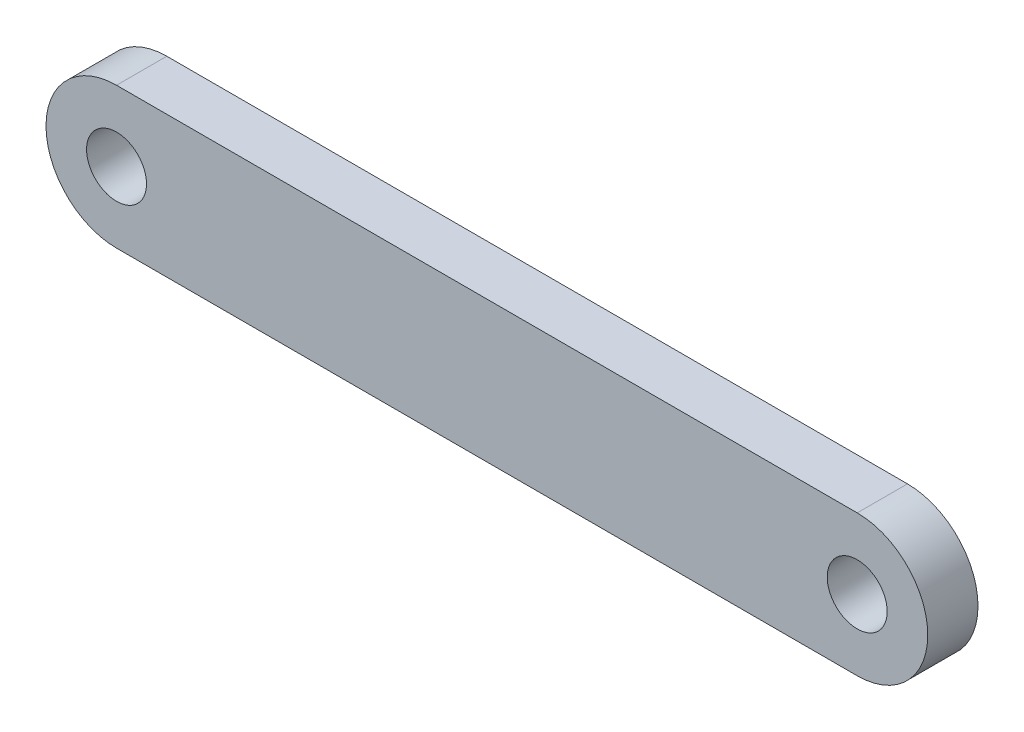
ISO-10303-21;
HEADER;
FILE_DESCRIPTION(('STEP AP214'),'2;1');
FILE_NAME('part.step','',(''),(''),'','','');
FILE_SCHEMA(('AUTOMOTIVE_DESIGN { 1 0 10303 214 1 1 1 1 }'));
ENDSEC;
DATA;
#1=APPLICATION_CONTEXT('core data for automotive mechanical design processes');
#2=APPLICATION_PROTOCOL_DEFINITION('international standard','automotive_design',2000,#1);
#3=PRODUCT_CONTEXT('',#1,'mechanical');
#4=PRODUCT('Part','Part','',(#3));
#5=PRODUCT_RELATED_PRODUCT_CATEGORY('part','',(#4));
#6=PRODUCT_DEFINITION_FORMATION('','',#4);
#7=PRODUCT_DEFINITION_CONTEXT('part definition',#1,'design');
#8=PRODUCT_DEFINITION('design','',#6,#7);
#9=PRODUCT_DEFINITION_SHAPE('','',#8);
#10=(LENGTH_UNIT() NAMED_UNIT(*) SI_UNIT(.MILLI.,.METRE.));
#11=(NAMED_UNIT(*) PLANE_ANGLE_UNIT() SI_UNIT($,.RADIAN.));
#12=(NAMED_UNIT(*) SI_UNIT($,.STERADIAN.) SOLID_ANGLE_UNIT());
#13=UNCERTAINTY_MEASURE_WITH_UNIT(LENGTH_MEASURE(1.E-05),#10,'distance_accuracy_value','');
#14=(GEOMETRIC_REPRESENTATION_CONTEXT(3) GLOBAL_UNCERTAINTY_ASSIGNED_CONTEXT((#13)) GLOBAL_UNIT_ASSIGNED_CONTEXT((#10,
#11,#12)) REPRESENTATION_CONTEXT('',''));
#15=CARTESIAN_POINT('',(0.,0.,0.));
#16=DIRECTION('',(0.,0.,1.));
#17=DIRECTION('',(1.,0.,0.));
#18=AXIS2_PLACEMENT_3D('',#15,#16,#17);
#19=CARTESIAN_POINT('',(0.,0.,2.85));
#20=DIRECTION('',(0.,0.,1.));
#21=DIRECTION('',(1.,0.,0.));
#22=AXIS2_PLACEMENT_3D('',#19,#20,#21);
#23=PLANE('',#22);
#24=DIRECTION('',(-1.,0.,0.));
#25=VECTOR('',#24,1.);
#26=CARTESIAN_POINT('',(-25.,4.,2.85));
#27=LINE('',#26,#25);
#28=CARTESIAN_POINT('',(21.,4.,2.85));
#29=VERTEX_POINT('',#28);
#30=CARTESIAN_POINT('',(-21.,4.,2.85));
#31=VERTEX_POINT('',#30);
#32=EDGE_CURVE('E79',#29,#31,#27,.T.);
#33=ORIENTED_EDGE('',*,*,#32,.T.);
#34=CARTESIAN_POINT('',(-21.,0.,2.85));
#35=DIRECTION('',(0.,0.,1.));
#36=DIRECTION('',(-1.,0.,0.));
#37=AXIS2_PLACEMENT_3D('',#34,#35,#36);
#38=CIRCLE('',#37,4.);
#39=CARTESIAN_POINT('',(-21.,-4.,2.85));
#40=VERTEX_POINT('',#39);
#41=EDGE_CURVE('E76',#31,#40,#38,.T.);
#42=ORIENTED_EDGE('',*,*,#41,.T.);
#43=DIRECTION('',(1.,0.,0.));
#44=VECTOR('',#43,1.);
#45=CARTESIAN_POINT('',(-25.,-4.,2.85));
#46=LINE('',#45,#44);
#47=CARTESIAN_POINT('',(21.,-4.,2.85));
#48=VERTEX_POINT('',#47);
#49=EDGE_CURVE('E61',#40,#48,#46,.T.);
#50=ORIENTED_EDGE('',*,*,#49,.T.);
#51=CARTESIAN_POINT('',(21.,0.,2.85));
#52=DIRECTION('',(0.,0.,-1.));
#53=DIRECTION('',(1.,0.,0.));
#54=AXIS2_PLACEMENT_3D('',#51,#52,#53);
#55=CIRCLE('',#54,4.);
#56=EDGE_CURVE('E104',#29,#48,#55,.T.);
#57=ORIENTED_EDGE('',*,*,#56,.F.);
#58=EDGE_LOOP('',(#33,#42,#50,#57));
#59=FACE_BOUND('',#58,.T.);
#60=CARTESIAN_POINT('',(21.,0.,2.85));
#61=DIRECTION('',(0.,0.,1.));
#62=DIRECTION('',(1.,0.,0.));
#63=AXIS2_PLACEMENT_3D('',#60,#61,#62);
#64=CIRCLE('',#63,1.7);
#65=CARTESIAN_POINT('',(22.7,0.,2.85));
#66=VERTEX_POINT('',#65);
#67=EDGE_CURVE('E88',#66,#66,#64,.T.);
#68=ORIENTED_EDGE('',*,*,#67,.F.);
#69=EDGE_LOOP('',(#68));
#70=FACE_BOUND('',#69,.T.);
#71=CARTESIAN_POINT('',(-21.,0.,2.85));
#72=DIRECTION('',(0.,0.,-1.));
#73=DIRECTION('',(-1.,0.,0.));
#74=AXIS2_PLACEMENT_3D('',#71,#72,#73);
#75=CIRCLE('',#74,1.7);
#76=CARTESIAN_POINT('',(-22.7,0.,2.85));
#77=VERTEX_POINT('',#76);
#78=EDGE_CURVE('E118',#77,#77,#75,.T.);
#79=ORIENTED_EDGE('',*,*,#78,.T.);
#80=EDGE_LOOP('',(#79));
#81=FACE_BOUND('',#80,.T.);
#82=ADVANCED_FACE('F33',(#59,#70,#81),#23,.T.);
#83=CARTESIAN_POINT('',(0.,0.,0.));
#84=DIRECTION('',(0.,0.,1.));
#85=DIRECTION('',(1.,0.,0.));
#86=AXIS2_PLACEMENT_3D('',#83,#84,#85);
#87=PLANE('',#86);
#88=CARTESIAN_POINT('',(-21.,0.,0.));
#89=DIRECTION('',(0.,0.,1.));
#90=DIRECTION('',(1.,0.,0.));
#91=AXIS2_PLACEMENT_3D('',#88,#89,#90);
#92=CIRCLE('',#91,4.);
#93=CARTESIAN_POINT('',(-21.,4.,0.));
#94=VERTEX_POINT('',#93);
#95=CARTESIAN_POINT('',(-21.,-4.,0.));
#96=VERTEX_POINT('',#95);
#97=EDGE_CURVE('E11',#94,#96,#92,.T.);
#98=ORIENTED_EDGE('',*,*,#97,.F.);
#99=DIRECTION('',(-1.,0.,0.));
#100=VECTOR('',#99,1.);
#101=CARTESIAN_POINT('',(-25.,4.,0.));
#102=LINE('',#101,#100);
#103=CARTESIAN_POINT('',(21.,4.,0.));
#104=VERTEX_POINT('',#103);
#105=EDGE_CURVE('E98',#104,#94,#102,.T.);
#106=ORIENTED_EDGE('',*,*,#105,.F.);
#107=CARTESIAN_POINT('',(21.,0.,0.));
#108=DIRECTION('',(0.,0.,1.));
#109=DIRECTION('',(1.,0.,0.));
#110=AXIS2_PLACEMENT_3D('',#107,#108,#109);
#111=CIRCLE('',#110,4.);
#112=CARTESIAN_POINT('',(21.,-4.,0.));
#113=VERTEX_POINT('',#112);
#114=EDGE_CURVE('E42',#104,#113,#111,.F.);
#115=ORIENTED_EDGE('',*,*,#114,.T.);
#116=DIRECTION('',(1.,0.,0.));
#117=VECTOR('',#116,1.);
#118=CARTESIAN_POINT('',(-25.,-4.,0.));
#119=LINE('',#118,#117);
#120=EDGE_CURVE('E94',#96,#113,#119,.T.);
#121=ORIENTED_EDGE('',*,*,#120,.F.);
#122=EDGE_LOOP('',(#98,#106,#115,#121));
#123=FACE_BOUND('',#122,.T.);
#124=CARTESIAN_POINT('',(21.,0.,0.));
#125=DIRECTION('',(0.,0.,1.));
#126=DIRECTION('',(1.,0.,0.));
#127=AXIS2_PLACEMENT_3D('',#124,#125,#126);
#128=CIRCLE('',#127,1.7);
#129=CARTESIAN_POINT('',(22.7,0.,0.));
#130=VERTEX_POINT('',#129);
#131=EDGE_CURVE('E112',#130,#130,#128,.T.);
#132=ORIENTED_EDGE('',*,*,#131,.T.);
#133=EDGE_LOOP('',(#132));
#134=FACE_BOUND('',#133,.T.);
#135=CARTESIAN_POINT('',(-21.,0.,0.));
#136=DIRECTION('',(0.,0.,-1.));
#137=DIRECTION('',(-1.,0.,0.));
#138=AXIS2_PLACEMENT_3D('',#135,#136,#137);
#139=CIRCLE('',#138,1.7);
#140=CARTESIAN_POINT('',(-22.7,0.,0.));
#141=VERTEX_POINT('',#140);
#142=EDGE_CURVE('E82',#141,#141,#139,.T.);
#143=ORIENTED_EDGE('',*,*,#142,.F.);
#144=EDGE_LOOP('',(#143));
#145=FACE_BOUND('',#144,.T.);
#146=ADVANCED_FACE('F106',(#123,#134,#145),#87,.F.);
#147=CARTESIAN_POINT('',(-25.,-4.,2.85));
#148=DIRECTION('',(0.,1.,0.));
#149=DIRECTION('',(0.,0.,1.));
#150=AXIS2_PLACEMENT_3D('',#147,#148,#149);
#151=PLANE('',#150);
#152=DIRECTION('',(0.,0.,1.));
#153=VECTOR('',#152,1.);
#154=CARTESIAN_POINT('',(-21.,-4.,0.));
#155=LINE('',#154,#153);
#156=EDGE_CURVE('E84',#96,#40,#155,.T.);
#157=ORIENTED_EDGE('',*,*,#156,.F.);
#158=ORIENTED_EDGE('',*,*,#120,.T.);
#159=DIRECTION('',(0.,0.,1.));
#160=VECTOR('',#159,1.);
#161=CARTESIAN_POINT('',(21.,-4.,0.));
#162=LINE('',#161,#160);
#163=EDGE_CURVE('E92',#113,#48,#162,.T.);
#164=ORIENTED_EDGE('',*,*,#163,.T.);
#165=ORIENTED_EDGE('',*,*,#49,.F.);
#166=EDGE_LOOP('',(#157,#158,#164,#165));
#167=FACE_BOUND('',#166,.T.);
#168=ADVANCED_FACE('F91',(#167),#151,.F.);
#169=CARTESIAN_POINT('',(-25.,4.,2.85));
#170=DIRECTION('',(0.,-1.,0.));
#171=DIRECTION('',(0.,0.,-1.));
#172=AXIS2_PLACEMENT_3D('',#169,#170,#171);
#173=PLANE('',#172);
#174=ORIENTED_EDGE('',*,*,#105,.T.);
#175=DIRECTION('',(0.,0.,1.));
#176=VECTOR('',#175,1.);
#177=CARTESIAN_POINT('',(-21.,4.,0.));
#178=LINE('',#177,#176);
#179=EDGE_CURVE('E81',#94,#31,#178,.T.);
#180=ORIENTED_EDGE('',*,*,#179,.T.);
#181=ORIENTED_EDGE('',*,*,#32,.F.);
#182=DIRECTION('',(0.,0.,1.));
#183=VECTOR('',#182,1.);
#184=CARTESIAN_POINT('',(21.,4.,0.));
#185=LINE('',#184,#183);
#186=EDGE_CURVE('E101',#104,#29,#185,.T.);
#187=ORIENTED_EDGE('',*,*,#186,.F.);
#188=EDGE_LOOP('',(#174,#180,#181,#187));
#189=FACE_BOUND('',#188,.T.);
#190=ADVANCED_FACE('F35',(#189),#173,.F.);
#191=CARTESIAN_POINT('',(21.,0.,0.));
#192=DIRECTION('',(0.,0.,1.));
#193=DIRECTION('',(1.,0.,0.));
#194=AXIS2_PLACEMENT_3D('',#191,#192,#193);
#195=CYLINDRICAL_SURFACE('',#194,4.);
#196=ORIENTED_EDGE('',*,*,#56,.T.);
#197=ORIENTED_EDGE('',*,*,#163,.F.);
#198=ORIENTED_EDGE('',*,*,#114,.F.);
#199=ORIENTED_EDGE('',*,*,#186,.T.);
#200=EDGE_LOOP('',(#196,#197,#198,#199));
#201=FACE_BOUND('',#200,.T.);
#202=ADVANCED_FACE('F103',(#201),#195,.T.);
#203=CARTESIAN_POINT('',(21.,0.,0.));
#204=DIRECTION('',(0.,0.,1.));
#205=DIRECTION('',(1.,0.,0.));
#206=AXIS2_PLACEMENT_3D('',#203,#204,#205);
#207=CYLINDRICAL_SURFACE('',#206,1.7);
#208=ORIENTED_EDGE('',*,*,#131,.F.);
#209=EDGE_LOOP('',(#208));
#210=FACE_BOUND('',#209,.T.);
#211=ORIENTED_EDGE('',*,*,#67,.T.);
#212=EDGE_LOOP('',(#211));
#213=FACE_BOUND('',#212,.T.);
#214=ADVANCED_FACE('F137',(#210,#213),#207,.F.);
#215=CARTESIAN_POINT('',(-21.,0.,0.));
#216=DIRECTION('',(0.,0.,1.));
#217=DIRECTION('',(1.,0.,0.));
#218=AXIS2_PLACEMENT_3D('',#215,#216,#217);
#219=CYLINDRICAL_SURFACE('',#218,4.);
#220=ORIENTED_EDGE('',*,*,#179,.F.);
#221=ORIENTED_EDGE('',*,*,#97,.T.);
#222=ORIENTED_EDGE('',*,*,#156,.T.);
#223=ORIENTED_EDGE('',*,*,#41,.F.);
#224=EDGE_LOOP('',(#220,#221,#222,#223));
#225=FACE_BOUND('',#224,.T.);
#226=ADVANCED_FACE('F85',(#225),#219,.T.);
#227=CARTESIAN_POINT('',(-21.,0.,0.));
#228=DIRECTION('',(0.,0.,1.));
#229=DIRECTION('',(1.,0.,0.));
#230=AXIS2_PLACEMENT_3D('',#227,#228,#229);
#231=CYLINDRICAL_SURFACE('',#230,1.7);
#232=ORIENTED_EDGE('',*,*,#142,.T.);
#233=EDGE_LOOP('',(#232));
#234=FACE_BOUND('',#233,.T.);
#235=ORIENTED_EDGE('',*,*,#78,.F.);
#236=EDGE_LOOP('',(#235));
#237=FACE_BOUND('',#236,.T.);
#238=ADVANCED_FACE('F124',(#234,#237),#231,.F.);
#239=CLOSED_SHELL('',(#82,#146,#168,#190,#202,#214,#226,#238));
#240=MANIFOLD_SOLID_BREP('B2',#239);
#241=ADVANCED_BREP_SHAPE_REPRESENTATION('',(#18,#240),#14);
#242=SHAPE_DEFINITION_REPRESENTATION(#9,#241);
ENDSEC;
END-ISO-10303-21;
